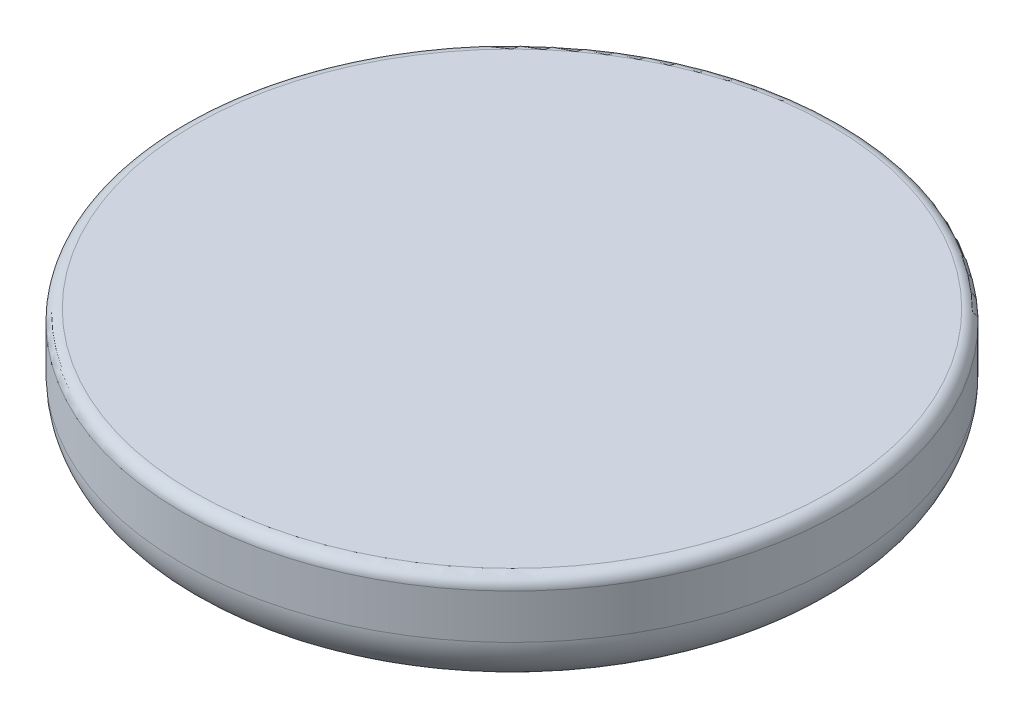
ISO-10303-21;
HEADER;
FILE_DESCRIPTION(('STEP AP214'),'2;1');
FILE_NAME('part.step','',(''),(''),'','','');
FILE_SCHEMA(('AUTOMOTIVE_DESIGN { 1 0 10303 214 1 1 1 1 }'));
ENDSEC;
DATA;
#1=APPLICATION_CONTEXT('core data for automotive mechanical design processes');
#2=APPLICATION_PROTOCOL_DEFINITION('international standard','automotive_design',2000,#1);
#3=PRODUCT_CONTEXT('',#1,'mechanical');
#4=PRODUCT('Part','Part','',(#3));
#5=PRODUCT_RELATED_PRODUCT_CATEGORY('part','',(#4));
#6=PRODUCT_DEFINITION_FORMATION('','',#4);
#7=PRODUCT_DEFINITION_CONTEXT('part definition',#1,'design');
#8=PRODUCT_DEFINITION('design','',#6,#7);
#9=PRODUCT_DEFINITION_SHAPE('','',#8);
#10=(LENGTH_UNIT() NAMED_UNIT(*) SI_UNIT(.MILLI.,.METRE.));
#11=(NAMED_UNIT(*) PLANE_ANGLE_UNIT() SI_UNIT($,.RADIAN.));
#12=(NAMED_UNIT(*) SI_UNIT($,.STERADIAN.) SOLID_ANGLE_UNIT());
#13=UNCERTAINTY_MEASURE_WITH_UNIT(LENGTH_MEASURE(1.E-05),#10,'distance_accuracy_value','');
#14=(GEOMETRIC_REPRESENTATION_CONTEXT(3) GLOBAL_UNCERTAINTY_ASSIGNED_CONTEXT((#13)) GLOBAL_UNIT_ASSIGNED_CONTEXT((#10,
#11,#12)) REPRESENTATION_CONTEXT('',''));
#15=CARTESIAN_POINT('',(0.,0.,0.));
#16=DIRECTION('',(0.,0.,1.));
#17=DIRECTION('',(1.,0.,0.));
#18=AXIS2_PLACEMENT_3D('',#15,#16,#17);
#19=CARTESIAN_POINT('',(0.,3.2,0.));
#20=DIRECTION('',(0.,-1.,0.));
#21=DIRECTION('',(0.,0.,-1.));
#22=AXIS2_PLACEMENT_3D('',#19,#20,#21);
#23=CYLINDRICAL_SURFACE('',#22,10.);
#24=CARTESIAN_POINT('',(0.,1.5,0.));
#25=DIRECTION('',(0.,1.,0.));
#26=DIRECTION('',(0.,0.,1.));
#27=AXIS2_PLACEMENT_3D('',#24,#25,#26);
#28=CIRCLE('',#27,10.);
#29=CARTESIAN_POINT('',(0.,1.5,10.));
#30=VERTEX_POINT('',#29);
#31=EDGE_CURVE('E40',#30,#30,#28,.T.);
#32=ORIENTED_EDGE('',*,*,#31,.T.);
#33=EDGE_LOOP('',(#32));
#34=FACE_BOUND('',#33,.T.);
#35=CARTESIAN_POINT('',(0.,2.85,0.));
#36=DIRECTION('',(0.,1.,0.));
#37=DIRECTION('',(0.,0.,1.));
#38=AXIS2_PLACEMENT_3D('',#35,#36,#37);
#39=CIRCLE('',#38,10.);
#40=CARTESIAN_POINT('',(0.,2.85,10.));
#41=VERTEX_POINT('',#40);
#42=EDGE_CURVE('E44',#41,#41,#39,.F.);
#43=ORIENTED_EDGE('',*,*,#42,.T.);
#44=EDGE_LOOP('',(#43));
#45=FACE_BOUND('',#44,.T.);
#46=ADVANCED_FACE('F33',(#34,#45),#23,.T.);
#47=CARTESIAN_POINT('',(0.,3.2,0.));
#48=DIRECTION('',(0.,1.,0.));
#49=DIRECTION('',(0.,0.,1.));
#50=AXIS2_PLACEMENT_3D('',#47,#48,#49);
#51=PLANE('',#50);
#52=CARTESIAN_POINT('',(0.,3.2,0.));
#53=DIRECTION('',(0.,1.,0.));
#54=DIRECTION('',(0.,0.,1.));
#55=AXIS2_PLACEMENT_3D('',#52,#53,#54);
#56=CIRCLE('',#55,9.65);
#57=CARTESIAN_POINT('',(0.,3.2,9.65));
#58=VERTEX_POINT('',#57);
#59=EDGE_CURVE('E48',#58,#58,#56,.T.);
#60=ORIENTED_EDGE('',*,*,#59,.T.);
#61=EDGE_LOOP('',(#60));
#62=FACE_BOUND('',#61,.T.);
#63=ADVANCED_FACE('F54',(#62),#51,.T.);
#64=CARTESIAN_POINT('',(0.,0.,0.));
#65=DIRECTION('',(0.,1.,0.));
#66=DIRECTION('',(0.,0.,1.));
#67=AXIS2_PLACEMENT_3D('',#64,#65,#66);
#68=PLANE('',#67);
#69=CARTESIAN_POINT('',(0.,0.,0.));
#70=DIRECTION('',(0.,1.,0.));
#71=DIRECTION('',(0.,0.,1.));
#72=AXIS2_PLACEMENT_3D('',#69,#70,#71);
#73=CIRCLE('',#72,8.5);
#74=CARTESIAN_POINT('',(0.,0.,8.5));
#75=VERTEX_POINT('',#74);
#76=EDGE_CURVE('E10',#75,#75,#73,.F.);
#77=ORIENTED_EDGE('',*,*,#76,.T.);
#78=EDGE_LOOP('',(#77));
#79=FACE_BOUND('',#78,.T.);
#80=ADVANCED_FACE('F58',(#79),#68,.F.);
#81=CARTESIAN_POINT('',(0.,2.85,0.));
#82=DIRECTION('',(0.,1.,0.));
#83=DIRECTION('',(0.,0.,1.));
#84=AXIS2_PLACEMENT_3D('',#81,#82,#83);
#85=TOROIDAL_SURFACE('',#84,9.65,0.35);
#86=ORIENTED_EDGE('',*,*,#42,.F.);
#87=EDGE_LOOP('',(#86));
#88=FACE_BOUND('',#87,.T.);
#89=ORIENTED_EDGE('',*,*,#59,.F.);
#90=EDGE_LOOP('',(#89));
#91=FACE_BOUND('',#90,.T.);
#92=ADVANCED_FACE('F56',(#88,#91),#85,.T.);
#93=CARTESIAN_POINT('',(0.,1.5,0.));
#94=DIRECTION('',(0.,1.,0.));
#95=DIRECTION('',(0.,0.,1.));
#96=AXIS2_PLACEMENT_3D('',#93,#94,#95);
#97=TOROIDAL_SURFACE('',#96,8.5,1.5);
#98=ORIENTED_EDGE('',*,*,#76,.F.);
#99=EDGE_LOOP('',(#98));
#100=FACE_BOUND('',#99,.T.);
#101=ORIENTED_EDGE('',*,*,#31,.F.);
#102=EDGE_LOOP('',(#101));
#103=FACE_BOUND('',#102,.T.);
#104=ADVANCED_FACE('F35',(#100,#103),#97,.T.);
#105=CLOSED_SHELL('',(#46,#63,#80,#92,#104));
#106=MANIFOLD_SOLID_BREP('B2',#105);
#107=ADVANCED_BREP_SHAPE_REPRESENTATION('',(#18,#106),#14);
#108=SHAPE_DEFINITION_REPRESENTATION(#9,#107);
ENDSEC;
END-ISO-10303-21;
